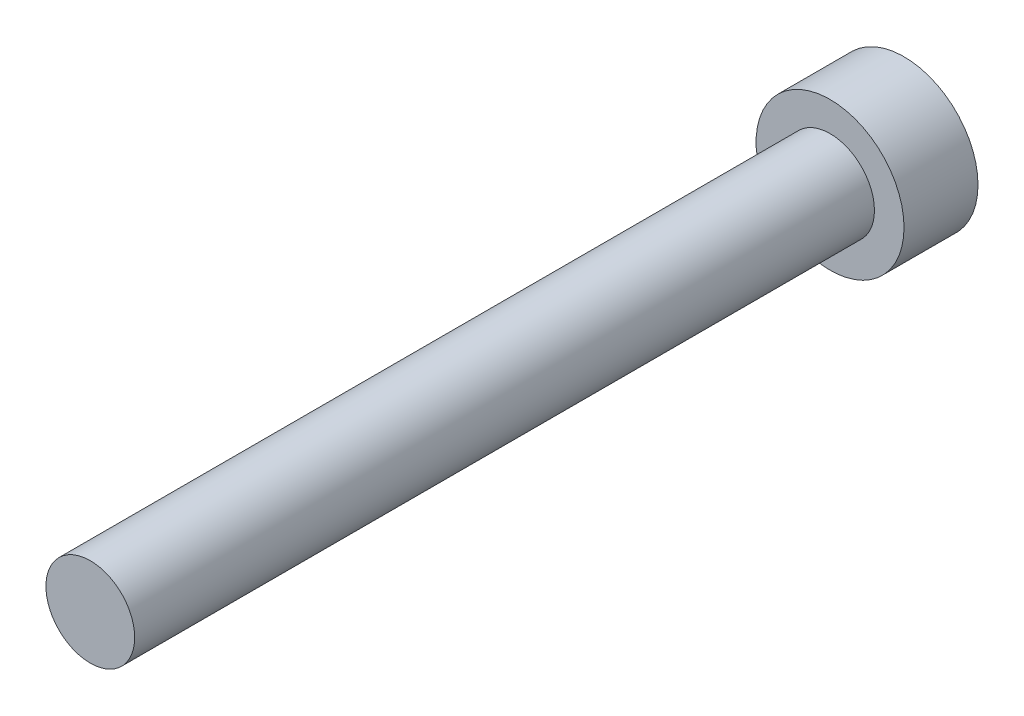
ISO-10303-21;
HEADER;
FILE_DESCRIPTION(('STEP AP214'),'2;1');
FILE_NAME('part.step','',(''),(''),'','','');
FILE_SCHEMA(('AUTOMOTIVE_DESIGN { 1 0 10303 214 1 1 1 1 }'));
ENDSEC;
DATA;
#1=APPLICATION_CONTEXT('core data for automotive mechanical design processes');
#2=APPLICATION_PROTOCOL_DEFINITION('international standard','automotive_design',2000,#1);
#3=PRODUCT_CONTEXT('',#1,'mechanical');
#4=PRODUCT('Part','Part','',(#3));
#5=PRODUCT_RELATED_PRODUCT_CATEGORY('part','',(#4));
#6=PRODUCT_DEFINITION_FORMATION('','',#4);
#7=PRODUCT_DEFINITION_CONTEXT('part definition',#1,'design');
#8=PRODUCT_DEFINITION('design','',#6,#7);
#9=PRODUCT_DEFINITION_SHAPE('','',#8);
#10=(LENGTH_UNIT() NAMED_UNIT(*) SI_UNIT(.MILLI.,.METRE.));
#11=(NAMED_UNIT(*) PLANE_ANGLE_UNIT() SI_UNIT($,.RADIAN.));
#12=(NAMED_UNIT(*) SI_UNIT($,.STERADIAN.) SOLID_ANGLE_UNIT());
#13=UNCERTAINTY_MEASURE_WITH_UNIT(LENGTH_MEASURE(1.E-05),#10,'distance_accuracy_value','');
#14=(GEOMETRIC_REPRESENTATION_CONTEXT(3) GLOBAL_UNCERTAINTY_ASSIGNED_CONTEXT((#13)) GLOBAL_UNIT_ASSIGNED_CONTEXT((#10,
#11,#12)) REPRESENTATION_CONTEXT('',''));
#15=CARTESIAN_POINT('',(0.,0.,0.));
#16=DIRECTION('',(0.,0.,1.));
#17=DIRECTION('',(1.,0.,0.));
#18=AXIS2_PLACEMENT_3D('',#15,#16,#17);
#19=CARTESIAN_POINT('',(0.,0.,0.));
#20=DIRECTION('',(0.,0.,1.));
#21=DIRECTION('',(1.,0.,0.));
#22=AXIS2_PLACEMENT_3D('',#19,#20,#21);
#23=PLANE('',#22);
#24=CARTESIAN_POINT('',(0.,0.,0.));
#25=DIRECTION('',(0.,0.,1.));
#26=DIRECTION('',(1.,0.,0.));
#27=AXIS2_PLACEMENT_3D('',#24,#25,#26);
#28=CIRCLE('',#27,2.5);
#29=CARTESIAN_POINT('',(2.5,0.,0.));
#30=VERTEX_POINT('',#29);
#31=EDGE_CURVE('E39',#30,#30,#28,.T.);
#32=ORIENTED_EDGE('',*,*,#31,.T.);
#33=EDGE_LOOP('',(#32));
#34=FACE_BOUND('',#33,.T.);
#35=CARTESIAN_POINT('',(0.,0.,0.));
#36=DIRECTION('',(0.,0.,1.));
#37=DIRECTION('',(1.,0.,0.));
#38=AXIS2_PLACEMENT_3D('',#35,#36,#37);
#39=CIRCLE('',#38,1.5);
#40=CARTESIAN_POINT('',(1.5,0.,0.));
#41=VERTEX_POINT('',#40);
#42=EDGE_CURVE('E48',#41,#41,#39,.T.);
#43=ORIENTED_EDGE('',*,*,#42,.F.);
#44=EDGE_LOOP('',(#43));
#45=FACE_BOUND('',#44,.T.);
#46=ADVANCED_FACE('F35',(#34,#45),#23,.T.);
#47=CARTESIAN_POINT('',(0.,0.,-2.5));
#48=DIRECTION('',(0.,0.,1.));
#49=DIRECTION('',(1.,0.,0.));
#50=AXIS2_PLACEMENT_3D('',#47,#48,#49);
#51=CYLINDRICAL_SURFACE('',#50,2.5);
#52=CARTESIAN_POINT('',(0.,0.,-2.5));
#53=DIRECTION('',(0.,0.,1.));
#54=DIRECTION('',(1.,0.,0.));
#55=AXIS2_PLACEMENT_3D('',#52,#53,#54);
#56=CIRCLE('',#55,2.5);
#57=CARTESIAN_POINT('',(2.5,0.,-2.5));
#58=VERTEX_POINT('',#57);
#59=EDGE_CURVE('E10',#58,#58,#56,.T.);
#60=ORIENTED_EDGE('',*,*,#59,.T.);
#61=EDGE_LOOP('',(#60));
#62=FACE_BOUND('',#61,.T.);
#63=ORIENTED_EDGE('',*,*,#31,.F.);
#64=EDGE_LOOP('',(#63));
#65=FACE_BOUND('',#64,.T.);
#66=ADVANCED_FACE('F37',(#62,#65),#51,.T.);
#67=CARTESIAN_POINT('',(0.,0.,-2.5));
#68=DIRECTION('',(0.,0.,1.));
#69=DIRECTION('',(1.,0.,0.));
#70=AXIS2_PLACEMENT_3D('',#67,#68,#69);
#71=PLANE('',#70);
#72=ORIENTED_EDGE('',*,*,#59,.F.);
#73=EDGE_LOOP('',(#72));
#74=FACE_BOUND('',#73,.T.);
#75=ADVANCED_FACE('F59',(#74),#71,.F.);
#76=CARTESIAN_POINT('',(0.,0.,25.));
#77=DIRECTION('',(0.,0.,-1.));
#78=DIRECTION('',(-1.,0.,0.));
#79=AXIS2_PLACEMENT_3D('',#76,#77,#78);
#80=CYLINDRICAL_SURFACE('',#79,1.5);
#81=CARTESIAN_POINT('',(0.,0.,25.));
#82=DIRECTION('',(0.,0.,1.));
#83=DIRECTION('',(1.,0.,0.));
#84=AXIS2_PLACEMENT_3D('',#81,#82,#83);
#85=CIRCLE('',#84,1.5);
#86=CARTESIAN_POINT('',(1.5,0.,25.));
#87=VERTEX_POINT('',#86);
#88=EDGE_CURVE('E46',#87,#87,#85,.T.);
#89=ORIENTED_EDGE('',*,*,#88,.F.);
#90=EDGE_LOOP('',(#89));
#91=FACE_BOUND('',#90,.T.);
#92=ORIENTED_EDGE('',*,*,#42,.T.);
#93=EDGE_LOOP('',(#92));
#94=FACE_BOUND('',#93,.T.);
#95=ADVANCED_FACE('F56',(#91,#94),#80,.T.);
#96=CARTESIAN_POINT('',(0.,0.,25.));
#97=DIRECTION('',(0.,0.,1.));
#98=DIRECTION('',(1.,0.,0.));
#99=AXIS2_PLACEMENT_3D('',#96,#97,#98);
#100=PLANE('',#99);
#101=ORIENTED_EDGE('',*,*,#88,.T.);
#102=EDGE_LOOP('',(#101));
#103=FACE_BOUND('',#102,.T.);
#104=ADVANCED_FACE('F54',(#103),#100,.T.);
#105=CLOSED_SHELL('',(#46,#66,#75,#95,#104));
#106=MANIFOLD_SOLID_BREP('B2',#105);
#107=ADVANCED_BREP_SHAPE_REPRESENTATION('',(#18,#106),#14);
#108=SHAPE_DEFINITION_REPRESENTATION(#9,#107);
ENDSEC;
END-ISO-10303-21;
